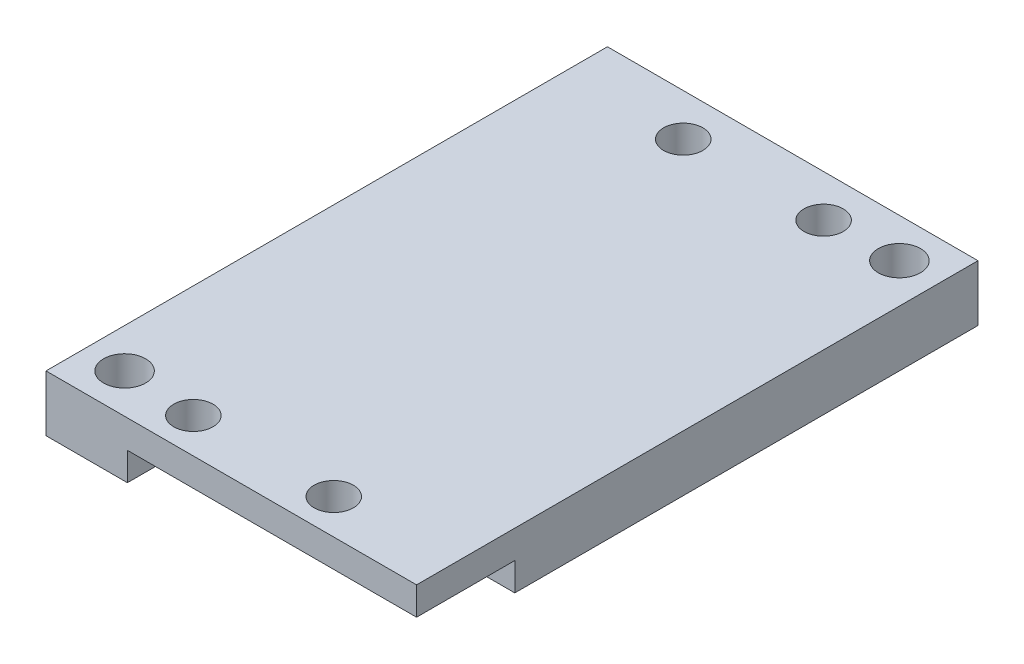
ISO-10303-21;
HEADER;
FILE_DESCRIPTION(('STEP AP214'),'2;1');
FILE_NAME('part.step','',(''),(''),'','','');
FILE_SCHEMA(('AUTOMOTIVE_DESIGN { 1 0 10303 214 1 1 1 1 }'));
ENDSEC;
DATA;
#1=APPLICATION_CONTEXT('core data for automotive mechanical design processes');
#2=APPLICATION_PROTOCOL_DEFINITION('international standard','automotive_design',2000,#1);
#3=PRODUCT_CONTEXT('',#1,'mechanical');
#4=PRODUCT('Part','Part','',(#3));
#5=PRODUCT_RELATED_PRODUCT_CATEGORY('part','',(#4));
#6=PRODUCT_DEFINITION_FORMATION('','',#4);
#7=PRODUCT_DEFINITION_CONTEXT('part definition',#1,'design');
#8=PRODUCT_DEFINITION('design','',#6,#7);
#9=PRODUCT_DEFINITION_SHAPE('','',#8);
#10=(LENGTH_UNIT() NAMED_UNIT(*) SI_UNIT(.MILLI.,.METRE.));
#11=(NAMED_UNIT(*) PLANE_ANGLE_UNIT() SI_UNIT($,.RADIAN.));
#12=(NAMED_UNIT(*) SI_UNIT($,.STERADIAN.) SOLID_ANGLE_UNIT());
#13=UNCERTAINTY_MEASURE_WITH_UNIT(LENGTH_MEASURE(1.E-05),#10,'distance_accuracy_value','');
#14=(GEOMETRIC_REPRESENTATION_CONTEXT(3) GLOBAL_UNCERTAINTY_ASSIGNED_CONTEXT((#13)) GLOBAL_UNIT_ASSIGNED_CONTEXT((#10,
#11,#12)) REPRESENTATION_CONTEXT('',''));
#15=CARTESIAN_POINT('',(0.,0.,0.));
#16=DIRECTION('',(0.,0.,1.));
#17=DIRECTION('',(1.,0.,0.));
#18=AXIS2_PLACEMENT_3D('',#15,#16,#17);
#19=CARTESIAN_POINT('',(-6.6,2.,-10.));
#20=DIRECTION('',(0.,0.,-1.));
#21=DIRECTION('',(-1.,0.,0.));
#22=AXIS2_PLACEMENT_3D('',#19,#20,#21);
#23=PLANE('',#22);
#24=DIRECTION('',(1.,0.,0.));
#25=VECTOR('',#24,1.);
#26=CARTESIAN_POINT('',(-6.6,0.,-10.));
#27=LINE('',#26,#25);
#28=CARTESIAN_POINT('',(3.7,0.,-10.));
#29=VERTEX_POINT('',#28);
#30=CARTESIAN_POINT('',(6.6,0.,-10.));
#31=VERTEX_POINT('',#30);
#32=EDGE_CURVE('E133',#29,#31,#27,.T.);
#33=ORIENTED_EDGE('',*,*,#32,.F.);
#34=DIRECTION('',(0.,-1.,0.));
#35=VECTOR('',#34,1.);
#36=CARTESIAN_POINT('',(3.7,1.,-10.));
#37=LINE('',#36,#35);
#38=CARTESIAN_POINT('',(3.7,1.,-10.));
#39=VERTEX_POINT('',#38);
#40=EDGE_CURVE('E127',#39,#29,#37,.T.);
#41=ORIENTED_EDGE('',*,*,#40,.F.);
#42=DIRECTION('',(-1.,0.,0.));
#43=VECTOR('',#42,1.);
#44=CARTESIAN_POINT('',(0.,1.,-10.));
#45=LINE('',#44,#43);
#46=CARTESIAN_POINT('',(-6.6,1.,-10.));
#47=VERTEX_POINT('',#46);
#48=EDGE_CURVE('E115',#39,#47,#45,.T.);
#49=ORIENTED_EDGE('',*,*,#48,.T.);
#50=DIRECTION('',(0.,-1.,0.));
#51=VECTOR('',#50,1.);
#52=CARTESIAN_POINT('',(-6.6,2.,-10.));
#53=LINE('',#52,#51);
#54=CARTESIAN_POINT('',(-6.6,2.,-10.));
#55=VERTEX_POINT('',#54);
#56=EDGE_CURVE('E11',#55,#47,#53,.T.);
#57=ORIENTED_EDGE('',*,*,#56,.F.);
#58=DIRECTION('',(1.,0.,0.));
#59=VECTOR('',#58,1.);
#60=CARTESIAN_POINT('',(-6.6,2.,-10.));
#61=LINE('',#60,#59);
#62=CARTESIAN_POINT('',(6.6,2.,-10.));
#63=VERTEX_POINT('',#62);
#64=EDGE_CURVE('E173',#55,#63,#61,.T.);
#65=ORIENTED_EDGE('',*,*,#64,.T.);
#66=DIRECTION('',(0.,-1.,0.));
#67=VECTOR('',#66,1.);
#68=CARTESIAN_POINT('',(6.6,2.,-10.));
#69=LINE('',#68,#67);
#70=EDGE_CURVE('E184',#63,#31,#69,.T.);
#71=ORIENTED_EDGE('',*,*,#70,.T.);
#72=EDGE_LOOP('',(#33,#41,#49,#57,#65,#71));
#73=FACE_BOUND('',#72,.T.);
#74=ADVANCED_FACE('F37',(#73),#23,.T.);
#75=CARTESIAN_POINT('',(-6.6,2.,10.));
#76=DIRECTION('',(0.,0.,-1.));
#77=DIRECTION('',(-1.,0.,0.));
#78=AXIS2_PLACEMENT_3D('',#75,#76,#77);
#79=PLANE('',#78);
#80=DIRECTION('',(0.,-1.,0.));
#81=VECTOR('',#80,1.);
#82=CARTESIAN_POINT('',(-3.7,1.,10.));
#83=LINE('',#82,#81);
#84=CARTESIAN_POINT('',(-3.7,1.,10.));
#85=VERTEX_POINT('',#84);
#86=CARTESIAN_POINT('',(-3.7,0.,10.));
#87=VERTEX_POINT('',#86);
#88=EDGE_CURVE('E144',#85,#87,#83,.T.);
#89=ORIENTED_EDGE('',*,*,#88,.F.);
#90=DIRECTION('',(1.,0.,0.));
#91=VECTOR('',#90,1.);
#92=CARTESIAN_POINT('',(0.,1.,10.));
#93=LINE('',#92,#91);
#94=CARTESIAN_POINT('',(6.6,1.,10.));
#95=VERTEX_POINT('',#94);
#96=EDGE_CURVE('E160',#85,#95,#93,.T.);
#97=ORIENTED_EDGE('',*,*,#96,.T.);
#98=DIRECTION('',(0.,-1.,0.));
#99=VECTOR('',#98,1.);
#100=CARTESIAN_POINT('',(6.6,2.,10.));
#101=LINE('',#100,#99);
#102=CARTESIAN_POINT('',(6.6,2.,10.));
#103=VERTEX_POINT('',#102);
#104=EDGE_CURVE('E195',#103,#95,#101,.T.);
#105=ORIENTED_EDGE('',*,*,#104,.F.);
#106=DIRECTION('',(1.,0.,0.));
#107=VECTOR('',#106,1.);
#108=CARTESIAN_POINT('',(-6.6,2.,10.));
#109=LINE('',#108,#107);
#110=CARTESIAN_POINT('',(-6.6,2.,10.));
#111=VERTEX_POINT('',#110);
#112=EDGE_CURVE('E180',#111,#103,#109,.T.);
#113=ORIENTED_EDGE('',*,*,#112,.F.);
#114=DIRECTION('',(0.,-1.,0.));
#115=VECTOR('',#114,1.);
#116=CARTESIAN_POINT('',(-6.6,2.,10.));
#117=LINE('',#116,#115);
#118=CARTESIAN_POINT('',(-6.6,0.,10.));
#119=VERTEX_POINT('',#118);
#120=EDGE_CURVE('E45',#111,#119,#117,.T.);
#121=ORIENTED_EDGE('',*,*,#120,.T.);
#122=DIRECTION('',(1.,0.,0.));
#123=VECTOR('',#122,1.);
#124=CARTESIAN_POINT('',(-6.6,0.,10.));
#125=LINE('',#124,#123);
#126=EDGE_CURVE('E189',#119,#87,#125,.T.);
#127=ORIENTED_EDGE('',*,*,#126,.T.);
#128=EDGE_LOOP('',(#89,#97,#105,#113,#121,#127));
#129=FACE_BOUND('',#128,.T.);
#130=ADVANCED_FACE('F229',(#129),#79,.F.);
#131=CARTESIAN_POINT('',(0.,0.,0.));
#132=DIRECTION('',(0.,-1.,0.));
#133=DIRECTION('',(0.,0.,-1.));
#134=AXIS2_PLACEMENT_3D('',#131,#132,#133);
#135=PLANE('',#134);
#136=CARTESIAN_POINT('',(-5.2,0.,8.6));
#137=DIRECTION('',(0.,1.,0.));
#138=DIRECTION('',(0.,0.,1.));
#139=AXIS2_PLACEMENT_3D('',#136,#137,#138);
#140=CIRCLE('',#139,0.75);
#141=CARTESIAN_POINT('',(-5.2,0.,9.35));
#142=VERTEX_POINT('',#141);
#143=EDGE_CURVE('E168',#142,#142,#140,.T.);
#144=ORIENTED_EDGE('',*,*,#143,.T.);
#145=EDGE_LOOP('',(#144));
#146=FACE_BOUND('',#145,.T.);
#147=CARTESIAN_POINT('',(5.2,0.,-8.6));
#148=DIRECTION('',(0.,1.,0.));
#149=DIRECTION('',(0.,0.,1.));
#150=AXIS2_PLACEMENT_3D('',#147,#148,#149);
#151=CIRCLE('',#150,0.75);
#152=CARTESIAN_POINT('',(5.2,0.,-7.85));
#153=VERTEX_POINT('',#152);
#154=EDGE_CURVE('E138',#153,#153,#151,.T.);
#155=ORIENTED_EDGE('',*,*,#154,.T.);
#156=EDGE_LOOP('',(#155));
#157=FACE_BOUND('',#156,.T.);
#158=DIRECTION('',(-1.,0.,0.));
#159=VECTOR('',#158,1.);
#160=CARTESIAN_POINT('',(0.,0.,-6.5));
#161=LINE('',#160,#159);
#162=CARTESIAN_POINT('',(3.7,0.,-6.5));
#163=VERTEX_POINT('',#162);
#164=CARTESIAN_POINT('',(-6.6,0.,-6.5));
#165=VERTEX_POINT('',#164);
#166=EDGE_CURVE('E129',#163,#165,#161,.T.);
#167=ORIENTED_EDGE('',*,*,#166,.F.);
#168=DIRECTION('',(0.,0.,-1.));
#169=VECTOR('',#168,1.);
#170=CARTESIAN_POINT('',(3.7,0.,0.));
#171=LINE('',#170,#169);
#172=EDGE_CURVE('E53',#163,#29,#171,.T.);
#173=ORIENTED_EDGE('',*,*,#172,.T.);
#174=ORIENTED_EDGE('',*,*,#32,.T.);
#175=DIRECTION('',(0.,0.,1.));
#176=VECTOR('',#175,1.);
#177=CARTESIAN_POINT('',(6.6,0.,-10.));
#178=LINE('',#177,#176);
#179=CARTESIAN_POINT('',(6.6,0.,6.5));
#180=VERTEX_POINT('',#179);
#181=EDGE_CURVE('E186',#31,#180,#178,.T.);
#182=ORIENTED_EDGE('',*,*,#181,.T.);
#183=DIRECTION('',(1.,0.,0.));
#184=VECTOR('',#183,1.);
#185=CARTESIAN_POINT('',(0.,0.,6.5));
#186=LINE('',#185,#184);
#187=CARTESIAN_POINT('',(-3.7,0.,6.5));
#188=VERTEX_POINT('',#187);
#189=EDGE_CURVE('E152',#188,#180,#186,.T.);
#190=ORIENTED_EDGE('',*,*,#189,.F.);
#191=DIRECTION('',(0.,0.,1.));
#192=VECTOR('',#191,1.);
#193=CARTESIAN_POINT('',(-3.7,0.,0.));
#194=LINE('',#193,#192);
#195=EDGE_CURVE('E61',#188,#87,#194,.T.);
#196=ORIENTED_EDGE('',*,*,#195,.T.);
#197=ORIENTED_EDGE('',*,*,#126,.F.);
#198=DIRECTION('',(0.,0.,1.));
#199=VECTOR('',#198,1.);
#200=CARTESIAN_POINT('',(-6.6,0.,-10.));
#201=LINE('',#200,#199);
#202=EDGE_CURVE('E177',#165,#119,#201,.T.);
#203=ORIENTED_EDGE('',*,*,#202,.F.);
#204=EDGE_LOOP('',(#167,#173,#174,#182,#190,#196,#197,#203));
#205=FACE_BOUND('',#204,.T.);
#206=ADVANCED_FACE('F233',(#146,#157,#205),#135,.T.);
#207=CARTESIAN_POINT('',(-6.6,2.,-10.));
#208=DIRECTION('',(1.,0.,0.));
#209=DIRECTION('',(0.,0.,-1.));
#210=AXIS2_PLACEMENT_3D('',#207,#208,#209);
#211=PLANE('',#210);
#212=DIRECTION('',(0.,0.,-1.));
#213=VECTOR('',#212,1.);
#214=CARTESIAN_POINT('',(-6.6,1.,0.));
#215=LINE('',#214,#213);
#216=CARTESIAN_POINT('',(-6.6,1.,-6.5));
#217=VERTEX_POINT('',#216);
#218=EDGE_CURVE('E122',#217,#47,#215,.T.);
#219=ORIENTED_EDGE('',*,*,#218,.F.);
#220=DIRECTION('',(0.,-1.,0.));
#221=VECTOR('',#220,1.);
#222=CARTESIAN_POINT('',(-6.6,1.,-6.5));
#223=LINE('',#222,#221);
#224=EDGE_CURVE('E135',#217,#165,#223,.T.);
#225=ORIENTED_EDGE('',*,*,#224,.T.);
#226=ORIENTED_EDGE('',*,*,#202,.T.);
#227=ORIENTED_EDGE('',*,*,#120,.F.);
#228=DIRECTION('',(0.,0.,1.));
#229=VECTOR('',#228,1.);
#230=CARTESIAN_POINT('',(-6.6,2.,-10.));
#231=LINE('',#230,#229);
#232=EDGE_CURVE('E182',#55,#111,#231,.T.);
#233=ORIENTED_EDGE('',*,*,#232,.F.);
#234=ORIENTED_EDGE('',*,*,#56,.T.);
#235=EDGE_LOOP('',(#219,#225,#226,#227,#233,#234));
#236=FACE_BOUND('',#235,.T.);
#237=ADVANCED_FACE('F239',(#236),#211,.F.);
#238=CARTESIAN_POINT('',(6.6,2.,-10.));
#239=DIRECTION('',(1.,0.,0.));
#240=DIRECTION('',(0.,0.,-1.));
#241=AXIS2_PLACEMENT_3D('',#238,#239,#240);
#242=PLANE('',#241);
#243=DIRECTION('',(0.,-1.,0.));
#244=VECTOR('',#243,1.);
#245=CARTESIAN_POINT('',(6.6,1.,6.5));
#246=LINE('',#245,#244);
#247=CARTESIAN_POINT('',(6.6,1.,6.5));
#248=VERTEX_POINT('',#247);
#249=EDGE_CURVE('E146',#248,#180,#246,.T.);
#250=ORIENTED_EDGE('',*,*,#249,.T.);
#251=ORIENTED_EDGE('',*,*,#181,.F.);
#252=ORIENTED_EDGE('',*,*,#70,.F.);
#253=DIRECTION('',(0.,0.,1.));
#254=VECTOR('',#253,1.);
#255=CARTESIAN_POINT('',(6.6,2.,-10.));
#256=LINE('',#255,#254);
#257=EDGE_CURVE('E176',#63,#103,#256,.T.);
#258=ORIENTED_EDGE('',*,*,#257,.T.);
#259=ORIENTED_EDGE('',*,*,#104,.T.);
#260=DIRECTION('',(0.,0.,1.));
#261=VECTOR('',#260,1.);
#262=CARTESIAN_POINT('',(6.6,1.,0.));
#263=LINE('',#262,#261);
#264=EDGE_CURVE('E158',#248,#95,#263,.T.);
#265=ORIENTED_EDGE('',*,*,#264,.F.);
#266=EDGE_LOOP('',(#250,#251,#252,#258,#259,#265));
#267=FACE_BOUND('',#266,.T.);
#268=ADVANCED_FACE('F244',(#267),#242,.T.);
#269=CARTESIAN_POINT('',(0.,2.,0.));
#270=DIRECTION('',(0.,-1.,0.));
#271=DIRECTION('',(0.,0.,-1.));
#272=AXIS2_PLACEMENT_3D('',#269,#270,#271);
#273=PLANE('',#272);
#274=CARTESIAN_POINT('',(2.4,2.,8.75));
#275=DIRECTION('',(0.,1.,0.));
#276=DIRECTION('',(0.,0.,1.));
#277=AXIS2_PLACEMENT_3D('',#274,#275,#276);
#278=CIRCLE('',#277,0.700000000000001);
#279=CARTESIAN_POINT('',(2.4,2.,9.45));
#280=VERTEX_POINT('',#279);
#281=EDGE_CURVE('E391',#280,#280,#278,.T.);
#282=ORIENTED_EDGE('',*,*,#281,.F.);
#283=EDGE_LOOP('',(#282));
#284=FACE_BOUND('',#283,.T.);
#285=CARTESIAN_POINT('',(-2.4,2.,-8.5));
#286=DIRECTION('',(0.,1.,0.));
#287=DIRECTION('',(0.,0.,1.));
#288=AXIS2_PLACEMENT_3D('',#285,#286,#287);
#289=CIRCLE('',#288,0.699999999999999);
#290=CARTESIAN_POINT('',(-2.4,2.,-7.8));
#291=VERTEX_POINT('',#290);
#292=EDGE_CURVE('E385',#291,#291,#289,.T.);
#293=ORIENTED_EDGE('',*,*,#292,.F.);
#294=EDGE_LOOP('',(#293));
#295=FACE_BOUND('',#294,.T.);
#296=CARTESIAN_POINT('',(2.6,2.,-8.5));
#297=DIRECTION('',(0.,1.,0.));
#298=DIRECTION('',(0.,0.,1.));
#299=AXIS2_PLACEMENT_3D('',#296,#297,#298);
#300=CIRCLE('',#299,0.699999999999999);
#301=CARTESIAN_POINT('',(2.6,2.,-7.8));
#302=VERTEX_POINT('',#301);
#303=EDGE_CURVE('E392',#302,#302,#300,.T.);
#304=ORIENTED_EDGE('',*,*,#303,.F.);
#305=EDGE_LOOP('',(#304));
#306=FACE_BOUND('',#305,.T.);
#307=CARTESIAN_POINT('',(-2.6,2.,8.75000000000001));
#308=DIRECTION('',(0.,1.,0.));
#309=DIRECTION('',(0.,0.,1.));
#310=AXIS2_PLACEMENT_3D('',#307,#308,#309);
#311=CIRCLE('',#310,0.699999999999999);
#312=CARTESIAN_POINT('',(-2.6,2.,9.45));
#313=VERTEX_POINT('',#312);
#314=EDGE_CURVE('E203',#313,#313,#311,.T.);
#315=ORIENTED_EDGE('',*,*,#314,.F.);
#316=EDGE_LOOP('',(#315));
#317=FACE_BOUND('',#316,.T.);
#318=CARTESIAN_POINT('',(-5.2,2.,8.6));
#319=DIRECTION('',(0.,1.,0.));
#320=DIRECTION('',(0.,0.,1.));
#321=AXIS2_PLACEMENT_3D('',#318,#319,#320);
#322=CIRCLE('',#321,0.75);
#323=CARTESIAN_POINT('',(-5.2,2.,9.35));
#324=VERTEX_POINT('',#323);
#325=EDGE_CURVE('E165',#324,#324,#322,.T.);
#326=ORIENTED_EDGE('',*,*,#325,.F.);
#327=EDGE_LOOP('',(#326));
#328=FACE_BOUND('',#327,.T.);
#329=CARTESIAN_POINT('',(5.2,2.,-8.6));
#330=DIRECTION('',(0.,1.,0.));
#331=DIRECTION('',(0.,0.,1.));
#332=AXIS2_PLACEMENT_3D('',#329,#330,#331);
#333=CIRCLE('',#332,0.75);
#334=CARTESIAN_POINT('',(5.2,2.,-7.85));
#335=VERTEX_POINT('',#334);
#336=EDGE_CURVE('E134',#335,#335,#333,.T.);
#337=ORIENTED_EDGE('',*,*,#336,.F.);
#338=EDGE_LOOP('',(#337));
#339=FACE_BOUND('',#338,.T.);
#340=ORIENTED_EDGE('',*,*,#64,.F.);
#341=ORIENTED_EDGE('',*,*,#232,.T.);
#342=ORIENTED_EDGE('',*,*,#112,.T.);
#343=ORIENTED_EDGE('',*,*,#257,.F.);
#344=EDGE_LOOP('',(#340,#341,#342,#343));
#345=FACE_BOUND('',#344,.T.);
#346=ADVANCED_FACE('F246',(#284,#295,#306,#317,#328,#339,#345),#273,.F.);
#347=CARTESIAN_POINT('',(5.2,2.,-8.6));
#348=DIRECTION('',(0.,-1.,0.));
#349=DIRECTION('',(0.,0.,-1.));
#350=AXIS2_PLACEMENT_3D('',#347,#348,#349);
#351=CYLINDRICAL_SURFACE('',#350,0.75);
#352=ORIENTED_EDGE('',*,*,#336,.T.);
#353=EDGE_LOOP('',(#352));
#354=FACE_BOUND('',#353,.T.);
#355=ORIENTED_EDGE('',*,*,#154,.F.);
#356=EDGE_LOOP('',(#355));
#357=FACE_BOUND('',#356,.T.);
#358=ADVANCED_FACE('F252',(#354,#357),#351,.F.);
#359=CARTESIAN_POINT('',(-5.2,2.,8.6));
#360=DIRECTION('',(0.,-1.,0.));
#361=DIRECTION('',(0.,0.,-1.));
#362=AXIS2_PLACEMENT_3D('',#359,#360,#361);
#363=CYLINDRICAL_SURFACE('',#362,0.75);
#364=ORIENTED_EDGE('',*,*,#325,.T.);
#365=EDGE_LOOP('',(#364));
#366=FACE_BOUND('',#365,.T.);
#367=ORIENTED_EDGE('',*,*,#143,.F.);
#368=EDGE_LOOP('',(#367));
#369=FACE_BOUND('',#368,.T.);
#370=ADVANCED_FACE('F281',(#366,#369),#363,.F.);
#371=CARTESIAN_POINT('',(-3.7,1.,0.));
#372=DIRECTION('',(1.,0.,0.));
#373=DIRECTION('',(0.,0.,-1.));
#374=AXIS2_PLACEMENT_3D('',#371,#372,#373);
#375=PLANE('',#374);
#376=ORIENTED_EDGE('',*,*,#195,.F.);
#377=DIRECTION('',(0.,-1.,0.));
#378=VECTOR('',#377,1.);
#379=CARTESIAN_POINT('',(-3.7,1.,6.5));
#380=LINE('',#379,#378);
#381=CARTESIAN_POINT('',(-3.7,1.,6.5));
#382=VERTEX_POINT('',#381);
#383=EDGE_CURVE('E149',#382,#188,#380,.T.);
#384=ORIENTED_EDGE('',*,*,#383,.F.);
#385=DIRECTION('',(0.,0.,1.));
#386=VECTOR('',#385,1.);
#387=CARTESIAN_POINT('',(-3.7,1.,0.));
#388=LINE('',#387,#386);
#389=EDGE_CURVE('E154',#382,#85,#388,.T.);
#390=ORIENTED_EDGE('',*,*,#389,.T.);
#391=ORIENTED_EDGE('',*,*,#88,.T.);
#392=EDGE_LOOP('',(#376,#384,#390,#391));
#393=FACE_BOUND('',#392,.T.);
#394=ADVANCED_FACE('F272',(#393),#375,.T.);
#395=CARTESIAN_POINT('',(0.,1.,6.5));
#396=DIRECTION('',(0.,0.,-1.));
#397=DIRECTION('',(-1.,0.,0.));
#398=AXIS2_PLACEMENT_3D('',#395,#396,#397);
#399=PLANE('',#398);
#400=ORIENTED_EDGE('',*,*,#189,.T.);
#401=ORIENTED_EDGE('',*,*,#249,.F.);
#402=DIRECTION('',(1.,0.,0.));
#403=VECTOR('',#402,1.);
#404=CARTESIAN_POINT('',(0.,1.,6.5));
#405=LINE('',#404,#403);
#406=EDGE_CURVE('E151',#382,#248,#405,.T.);
#407=ORIENTED_EDGE('',*,*,#406,.F.);
#408=ORIENTED_EDGE('',*,*,#383,.T.);
#409=EDGE_LOOP('',(#400,#401,#407,#408));
#410=FACE_BOUND('',#409,.T.);
#411=ADVANCED_FACE('F273',(#410),#399,.F.);
#412=CARTESIAN_POINT('',(0.,1.,0.));
#413=DIRECTION('',(0.,1.,0.));
#414=DIRECTION('',(0.,0.,1.));
#415=AXIS2_PLACEMENT_3D('',#412,#413,#414);
#416=PLANE('',#415);
#417=CARTESIAN_POINT('',(2.4,1.,8.75));
#418=DIRECTION('',(0.,1.,0.));
#419=DIRECTION('',(0.,0.,1.));
#420=AXIS2_PLACEMENT_3D('',#417,#418,#419);
#421=CIRCLE('',#420,0.700000000000001);
#422=CARTESIAN_POINT('',(2.4,1.,9.45));
#423=VERTEX_POINT('',#422);
#424=EDGE_CURVE('E40',#423,#423,#421,.T.);
#425=ORIENTED_EDGE('',*,*,#424,.T.);
#426=EDGE_LOOP('',(#425));
#427=FACE_BOUND('',#426,.T.);
#428=CARTESIAN_POINT('',(-2.6,1.,8.75000000000001));
#429=DIRECTION('',(0.,1.,0.));
#430=DIRECTION('',(0.,0.,1.));
#431=AXIS2_PLACEMENT_3D('',#428,#429,#430);
#432=CIRCLE('',#431,0.699999999999999);
#433=CARTESIAN_POINT('',(-2.6,1.,9.45));
#434=VERTEX_POINT('',#433);
#435=EDGE_CURVE('E205',#434,#434,#432,.T.);
#436=ORIENTED_EDGE('',*,*,#435,.T.);
#437=EDGE_LOOP('',(#436));
#438=FACE_BOUND('',#437,.T.);
#439=ORIENTED_EDGE('',*,*,#389,.F.);
#440=ORIENTED_EDGE('',*,*,#406,.T.);
#441=ORIENTED_EDGE('',*,*,#264,.T.);
#442=ORIENTED_EDGE('',*,*,#96,.F.);
#443=EDGE_LOOP('',(#439,#440,#441,#442));
#444=FACE_BOUND('',#443,.T.);
#445=ADVANCED_FACE('F212',(#427,#438,#444),#416,.F.);
#446=CARTESIAN_POINT('',(3.7,1.,0.));
#447=DIRECTION('',(-1.,0.,0.));
#448=DIRECTION('',(0.,0.,1.));
#449=AXIS2_PLACEMENT_3D('',#446,#447,#448);
#450=PLANE('',#449);
#451=ORIENTED_EDGE('',*,*,#172,.F.);
#452=DIRECTION('',(0.,-1.,0.));
#453=VECTOR('',#452,1.);
#454=CARTESIAN_POINT('',(3.7,1.,-6.5));
#455=LINE('',#454,#453);
#456=CARTESIAN_POINT('',(3.7,1.,-6.5));
#457=VERTEX_POINT('',#456);
#458=EDGE_CURVE('E128',#457,#163,#455,.T.);
#459=ORIENTED_EDGE('',*,*,#458,.F.);
#460=DIRECTION('',(0.,0.,-1.));
#461=VECTOR('',#460,1.);
#462=CARTESIAN_POINT('',(3.7,1.,0.));
#463=LINE('',#462,#461);
#464=EDGE_CURVE('E119',#457,#39,#463,.T.);
#465=ORIENTED_EDGE('',*,*,#464,.T.);
#466=ORIENTED_EDGE('',*,*,#40,.T.);
#467=EDGE_LOOP('',(#451,#459,#465,#466));
#468=FACE_BOUND('',#467,.T.);
#469=ADVANCED_FACE('F126',(#468),#450,.T.);
#470=CARTESIAN_POINT('',(0.,1.,-6.5));
#471=DIRECTION('',(0.,0.,1.));
#472=DIRECTION('',(1.,0.,0.));
#473=AXIS2_PLACEMENT_3D('',#470,#471,#472);
#474=PLANE('',#473);
#475=ORIENTED_EDGE('',*,*,#166,.T.);
#476=ORIENTED_EDGE('',*,*,#224,.F.);
#477=DIRECTION('',(-1.,0.,0.));
#478=VECTOR('',#477,1.);
#479=CARTESIAN_POINT('',(0.,1.,-6.5));
#480=LINE('',#479,#478);
#481=EDGE_CURVE('E401',#457,#217,#480,.T.);
#482=ORIENTED_EDGE('',*,*,#481,.F.);
#483=ORIENTED_EDGE('',*,*,#458,.T.);
#484=EDGE_LOOP('',(#475,#476,#482,#483));
#485=FACE_BOUND('',#484,.T.);
#486=ADVANCED_FACE('F325',(#485),#474,.F.);
#487=CARTESIAN_POINT('',(0.,1.,0.));
#488=DIRECTION('',(0.,1.,0.));
#489=DIRECTION('',(0.,0.,1.));
#490=AXIS2_PLACEMENT_3D('',#487,#488,#489);
#491=PLANE('',#490);
#492=CARTESIAN_POINT('',(-2.4,1.,-8.5));
#493=DIRECTION('',(0.,1.,0.));
#494=DIRECTION('',(0.,0.,1.));
#495=AXIS2_PLACEMENT_3D('',#492,#493,#494);
#496=CIRCLE('',#495,0.699999999999999);
#497=CARTESIAN_POINT('',(-2.4,1.,-7.8));
#498=VERTEX_POINT('',#497);
#499=EDGE_CURVE('E202',#498,#498,#496,.T.);
#500=ORIENTED_EDGE('',*,*,#499,.T.);
#501=EDGE_LOOP('',(#500));
#502=FACE_BOUND('',#501,.T.);
#503=CARTESIAN_POINT('',(2.6,1.,-8.5));
#504=DIRECTION('',(0.,1.,0.));
#505=DIRECTION('',(0.,0.,1.));
#506=AXIS2_PLACEMENT_3D('',#503,#504,#505);
#507=CIRCLE('',#506,0.699999999999999);
#508=CARTESIAN_POINT('',(2.6,1.,-7.8));
#509=VERTEX_POINT('',#508);
#510=EDGE_CURVE('E199',#509,#509,#507,.T.);
#511=ORIENTED_EDGE('',*,*,#510,.T.);
#512=EDGE_LOOP('',(#511));
#513=FACE_BOUND('',#512,.T.);
#514=ORIENTED_EDGE('',*,*,#464,.F.);
#515=ORIENTED_EDGE('',*,*,#481,.T.);
#516=ORIENTED_EDGE('',*,*,#218,.T.);
#517=ORIENTED_EDGE('',*,*,#48,.F.);
#518=EDGE_LOOP('',(#514,#515,#516,#517));
#519=FACE_BOUND('',#518,.T.);
#520=ADVANCED_FACE('F117',(#502,#513,#519),#491,.F.);
#521=CARTESIAN_POINT('',(2.6,0.,-8.5));
#522=DIRECTION('',(0.,1.,0.));
#523=DIRECTION('',(0.,0.,1.));
#524=AXIS2_PLACEMENT_3D('',#521,#522,#523);
#525=CYLINDRICAL_SURFACE('',#524,0.699999999999999);
#526=ORIENTED_EDGE('',*,*,#303,.T.);
#527=EDGE_LOOP('',(#526));
#528=FACE_BOUND('',#527,.T.);
#529=ORIENTED_EDGE('',*,*,#510,.F.);
#530=EDGE_LOOP('',(#529));
#531=FACE_BOUND('',#530,.T.);
#532=ADVANCED_FACE('F351',(#528,#531),#525,.F.);
#533=CARTESIAN_POINT('',(-2.4,0.,-8.5));
#534=DIRECTION('',(0.,1.,0.));
#535=DIRECTION('',(0.,0.,1.));
#536=AXIS2_PLACEMENT_3D('',#533,#534,#535);
#537=CYLINDRICAL_SURFACE('',#536,0.699999999999999);
#538=ORIENTED_EDGE('',*,*,#292,.T.);
#539=EDGE_LOOP('',(#538));
#540=FACE_BOUND('',#539,.T.);
#541=ORIENTED_EDGE('',*,*,#499,.F.);
#542=EDGE_LOOP('',(#541));
#543=FACE_BOUND('',#542,.T.);
#544=ADVANCED_FACE('F222',(#540,#543),#537,.F.);
#545=CARTESIAN_POINT('',(-2.6,0.,8.75000000000001));
#546=DIRECTION('',(0.,1.,0.));
#547=DIRECTION('',(0.,0.,1.));
#548=AXIS2_PLACEMENT_3D('',#545,#546,#547);
#549=CYLINDRICAL_SURFACE('',#548,0.699999999999999);
#550=ORIENTED_EDGE('',*,*,#314,.T.);
#551=EDGE_LOOP('',(#550));
#552=FACE_BOUND('',#551,.T.);
#553=ORIENTED_EDGE('',*,*,#435,.F.);
#554=EDGE_LOOP('',(#553));
#555=FACE_BOUND('',#554,.T.);
#556=ADVANCED_FACE('F216',(#552,#555),#549,.F.);
#557=CARTESIAN_POINT('',(2.4,0.,8.75));
#558=DIRECTION('',(0.,1.,0.));
#559=DIRECTION('',(0.,0.,1.));
#560=AXIS2_PLACEMENT_3D('',#557,#558,#559);
#561=CYLINDRICAL_SURFACE('',#560,0.700000000000001);
#562=ORIENTED_EDGE('',*,*,#281,.T.);
#563=EDGE_LOOP('',(#562));
#564=FACE_BOUND('',#563,.T.);
#565=ORIENTED_EDGE('',*,*,#424,.F.);
#566=EDGE_LOOP('',(#565));
#567=FACE_BOUND('',#566,.T.);
#568=ADVANCED_FACE('F214',(#564,#567),#561,.F.);
#569=CLOSED_SHELL('',(#74,#130,#206,#237,#268,#346,#358,#370,#394,#411,#445,#469,#486,#520,#532,
#544,#556,#568));
#570=MANIFOLD_SOLID_BREP('B2',#569);
#571=ADVANCED_BREP_SHAPE_REPRESENTATION('',(#18,#570),#14);
#572=SHAPE_DEFINITION_REPRESENTATION(#9,#571);
ENDSEC;
END-ISO-10303-21;
